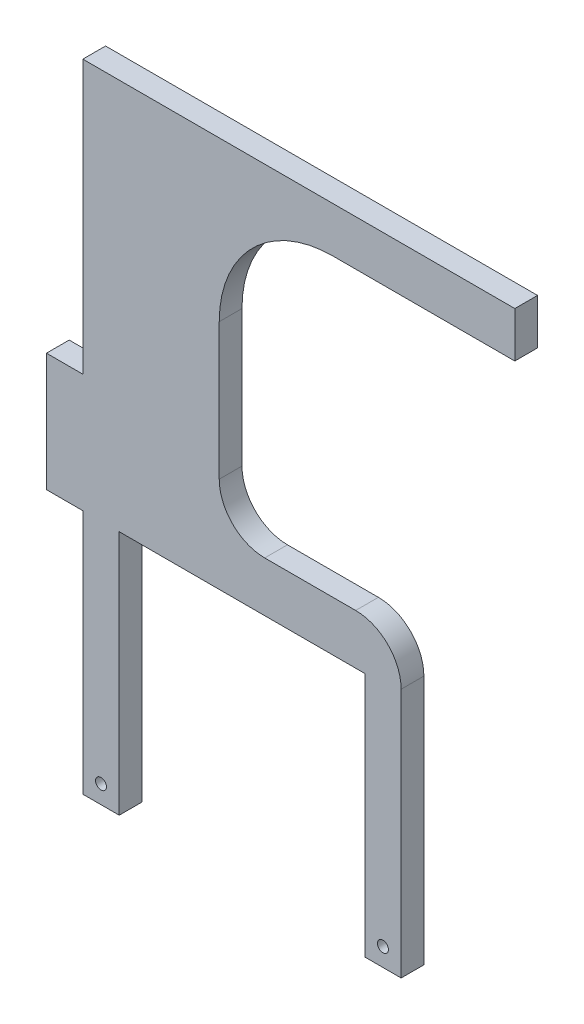
ISO-10303-21;
HEADER;
FILE_DESCRIPTION(('STEP AP214'),'2;1');
FILE_NAME('part.step','',(''),(''),'','','');
FILE_SCHEMA(('AUTOMOTIVE_DESIGN { 1 0 10303 214 1 1 1 1 }'));
ENDSEC;
DATA;
#1=APPLICATION_CONTEXT('core data for automotive mechanical design processes');
#2=APPLICATION_PROTOCOL_DEFINITION('international standard','automotive_design',2000,#1);
#3=PRODUCT_CONTEXT('',#1,'mechanical');
#4=PRODUCT('Part','Part','',(#3));
#5=PRODUCT_RELATED_PRODUCT_CATEGORY('part','',(#4));
#6=PRODUCT_DEFINITION_FORMATION('','',#4);
#7=PRODUCT_DEFINITION_CONTEXT('part definition',#1,'design');
#8=PRODUCT_DEFINITION('design','',#6,#7);
#9=PRODUCT_DEFINITION_SHAPE('','',#8);
#10=(LENGTH_UNIT() NAMED_UNIT(*) SI_UNIT(.MILLI.,.METRE.));
#11=(NAMED_UNIT(*) PLANE_ANGLE_UNIT() SI_UNIT($,.RADIAN.));
#12=(NAMED_UNIT(*) SI_UNIT($,.STERADIAN.) SOLID_ANGLE_UNIT());
#13=UNCERTAINTY_MEASURE_WITH_UNIT(LENGTH_MEASURE(1.E-05),#10,'distance_accuracy_value','');
#14=(GEOMETRIC_REPRESENTATION_CONTEXT(3) GLOBAL_UNCERTAINTY_ASSIGNED_CONTEXT((#13)) GLOBAL_UNIT_ASSIGNED_CONTEXT((#10,
#11,#12)) REPRESENTATION_CONTEXT('',''));
#15=CARTESIAN_POINT('',(0.,0.,0.));
#16=DIRECTION('',(0.,0.,1.));
#17=DIRECTION('',(1.,0.,0.));
#18=AXIS2_PLACEMENT_3D('',#15,#16,#17);
#19=CARTESIAN_POINT('',(0.,0.,5.));
#20=DIRECTION('',(0.,1.,0.));
#21=DIRECTION('',(0.,0.,1.));
#22=AXIS2_PLACEMENT_3D('',#19,#20,#21);
#23=PLANE('',#22);
#24=DIRECTION('',(1.,0.,0.));
#25=VECTOR('',#24,1.);
#26=CARTESIAN_POINT('',(0.,0.,0.));
#27=LINE('',#26,#25);
#28=CARTESIAN_POINT('',(0.,0.,0.));
#29=VERTEX_POINT('',#28);
#30=CARTESIAN_POINT('',(8.,0.,0.));
#31=VERTEX_POINT('',#30);
#32=EDGE_CURVE('E216',#29,#31,#27,.T.);
#33=ORIENTED_EDGE('',*,*,#32,.T.);
#34=DIRECTION('',(0.,0.,-1.));
#35=VECTOR('',#34,1.);
#36=CARTESIAN_POINT('',(8.,0.,5.));
#37=LINE('',#36,#35);
#38=CARTESIAN_POINT('',(8.,0.,5.));
#39=VERTEX_POINT('',#38);
#40=EDGE_CURVE('E300',#39,#31,#37,.T.);
#41=ORIENTED_EDGE('',*,*,#40,.F.);
#42=DIRECTION('',(1.,0.,0.));
#43=VECTOR('',#42,1.);
#44=CARTESIAN_POINT('',(0.,0.,5.));
#45=LINE('',#44,#43);
#46=CARTESIAN_POINT('',(0.,0.,5.));
#47=VERTEX_POINT('',#46);
#48=EDGE_CURVE('E262',#47,#39,#45,.T.);
#49=ORIENTED_EDGE('',*,*,#48,.F.);
#50=DIRECTION('',(0.,0.,-1.));
#51=VECTOR('',#50,1.);
#52=CARTESIAN_POINT('',(0.,0.,5.));
#53=LINE('',#52,#51);
#54=EDGE_CURVE('E215',#47,#29,#53,.T.);
#55=ORIENTED_EDGE('',*,*,#54,.T.);
#56=EDGE_LOOP('',(#33,#41,#49,#55));
#57=FACE_BOUND('',#56,.T.);
#58=ADVANCED_FACE('F39',(#57),#23,.F.);
#59=CARTESIAN_POINT('',(8.,0.,5.));
#60=DIRECTION('',(-1.,0.,0.));
#61=DIRECTION('',(0.,0.,1.));
#62=AXIS2_PLACEMENT_3D('',#59,#60,#61);
#63=PLANE('',#62);
#64=DIRECTION('',(0.,1.,0.));
#65=VECTOR('',#64,1.);
#66=CARTESIAN_POINT('',(8.,0.,0.));
#67=LINE('',#66,#65);
#68=CARTESIAN_POINT('',(8.,54.,0.));
#69=VERTEX_POINT('',#68);
#70=EDGE_CURVE('E220',#31,#69,#67,.T.);
#71=ORIENTED_EDGE('',*,*,#70,.T.);
#72=DIRECTION('',(0.,0.,-1.));
#73=VECTOR('',#72,1.);
#74=CARTESIAN_POINT('',(8.,54.,5.));
#75=LINE('',#74,#73);
#76=CARTESIAN_POINT('',(8.,54.,5.));
#77=VERTEX_POINT('',#76);
#78=EDGE_CURVE('E296',#77,#69,#75,.T.);
#79=ORIENTED_EDGE('',*,*,#78,.F.);
#80=DIRECTION('',(0.,1.,0.));
#81=VECTOR('',#80,1.);
#82=CARTESIAN_POINT('',(8.,0.,5.));
#83=LINE('',#82,#81);
#84=EDGE_CURVE('E371',#39,#77,#83,.T.);
#85=ORIENTED_EDGE('',*,*,#84,.F.);
#86=ORIENTED_EDGE('',*,*,#40,.T.);
#87=EDGE_LOOP('',(#71,#79,#85,#86));
#88=FACE_BOUND('',#87,.T.);
#89=ADVANCED_FACE('F409',(#88),#63,.F.);
#90=CARTESIAN_POINT('',(62.,54.,5.));
#91=DIRECTION('',(0.,1.,0.));
#92=DIRECTION('',(-1.,0.,0.));
#93=AXIS2_PLACEMENT_3D('',#90,#91,#92);
#94=PLANE('',#93);
#95=DIRECTION('',(1.,0.,0.));
#96=VECTOR('',#95,1.);
#97=CARTESIAN_POINT('',(62.,54.,0.));
#98=LINE('',#97,#96);
#99=CARTESIAN_POINT('',(62.,54.,0.));
#100=VERTEX_POINT('',#99);
#101=EDGE_CURVE('E224',#69,#100,#98,.T.);
#102=ORIENTED_EDGE('',*,*,#101,.T.);
#103=DIRECTION('',(0.,0.,-1.));
#104=VECTOR('',#103,1.);
#105=CARTESIAN_POINT('',(62.,54.,5.));
#106=LINE('',#105,#104);
#107=CARTESIAN_POINT('',(62.,54.,5.));
#108=VERTEX_POINT('',#107);
#109=EDGE_CURVE('E292',#108,#100,#106,.T.);
#110=ORIENTED_EDGE('',*,*,#109,.F.);
#111=DIRECTION('',(1.,0.,0.));
#112=VECTOR('',#111,1.);
#113=CARTESIAN_POINT('',(62.,54.,5.));
#114=LINE('',#113,#112);
#115=EDGE_CURVE('E374',#77,#108,#114,.T.);
#116=ORIENTED_EDGE('',*,*,#115,.F.);
#117=ORIENTED_EDGE('',*,*,#78,.T.);
#118=EDGE_LOOP('',(#102,#110,#116,#117));
#119=FACE_BOUND('',#118,.T.);
#120=ADVANCED_FACE('F403',(#119),#94,.F.);
#121=CARTESIAN_POINT('',(62.,0.,5.));
#122=DIRECTION('',(1.,0.,0.));
#123=DIRECTION('',(0.,0.,-1.));
#124=AXIS2_PLACEMENT_3D('',#121,#122,#123);
#125=PLANE('',#124);
#126=DIRECTION('',(0.,-1.,0.));
#127=VECTOR('',#126,1.);
#128=CARTESIAN_POINT('',(62.,0.,0.));
#129=LINE('',#128,#127);
#130=CARTESIAN_POINT('',(62.,0.,0.));
#131=VERTEX_POINT('',#130);
#132=EDGE_CURVE('E227',#100,#131,#129,.T.);
#133=ORIENTED_EDGE('',*,*,#132,.T.);
#134=DIRECTION('',(0.,0.,-1.));
#135=VECTOR('',#134,1.);
#136=CARTESIAN_POINT('',(62.,0.,5.));
#137=LINE('',#136,#135);
#138=CARTESIAN_POINT('',(62.,0.,5.));
#139=VERTEX_POINT('',#138);
#140=EDGE_CURVE('E288',#139,#131,#137,.T.);
#141=ORIENTED_EDGE('',*,*,#140,.F.);
#142=DIRECTION('',(0.,-1.,0.));
#143=VECTOR('',#142,1.);
#144=CARTESIAN_POINT('',(62.,0.,5.));
#145=LINE('',#144,#143);
#146=EDGE_CURVE('E377',#108,#139,#145,.T.);
#147=ORIENTED_EDGE('',*,*,#146,.F.);
#148=ORIENTED_EDGE('',*,*,#109,.T.);
#149=EDGE_LOOP('',(#133,#141,#147,#148));
#150=FACE_BOUND('',#149,.T.);
#151=ADVANCED_FACE('F399',(#150),#125,.F.);
#152=CARTESIAN_POINT('',(70.,0.,5.));
#153=DIRECTION('',(0.,1.,0.));
#154=DIRECTION('',(-1.,0.,0.));
#155=AXIS2_PLACEMENT_3D('',#152,#153,#154);
#156=PLANE('',#155);
#157=DIRECTION('',(1.,0.,0.));
#158=VECTOR('',#157,1.);
#159=CARTESIAN_POINT('',(70.,0.,0.));
#160=LINE('',#159,#158);
#161=CARTESIAN_POINT('',(70.,0.,0.));
#162=VERTEX_POINT('',#161);
#163=EDGE_CURVE('E230',#131,#162,#160,.T.);
#164=ORIENTED_EDGE('',*,*,#163,.T.);
#165=DIRECTION('',(0.,0.,-1.));
#166=VECTOR('',#165,1.);
#167=CARTESIAN_POINT('',(70.,0.,5.));
#168=LINE('',#167,#166);
#169=CARTESIAN_POINT('',(70.,0.,5.));
#170=VERTEX_POINT('',#169);
#171=EDGE_CURVE('E284',#170,#162,#168,.T.);
#172=ORIENTED_EDGE('',*,*,#171,.F.);
#173=DIRECTION('',(1.,0.,0.));
#174=VECTOR('',#173,1.);
#175=CARTESIAN_POINT('',(70.,0.,5.));
#176=LINE('',#175,#174);
#177=EDGE_CURVE('E380',#139,#170,#176,.T.);
#178=ORIENTED_EDGE('',*,*,#177,.F.);
#179=ORIENTED_EDGE('',*,*,#140,.T.);
#180=EDGE_LOOP('',(#164,#172,#178,#179));
#181=FACE_BOUND('',#180,.T.);
#182=ADVANCED_FACE('F395',(#181),#156,.F.);
#183=CARTESIAN_POINT('',(70.,80.,5.));
#184=DIRECTION('',(-1.,0.,0.));
#185=DIRECTION('',(0.,-1.,0.));
#186=AXIS2_PLACEMENT_3D('',#183,#184,#185);
#187=PLANE('',#186);
#188=DIRECTION('',(0.,1.,0.));
#189=VECTOR('',#188,1.);
#190=CARTESIAN_POINT('',(70.,80.,0.));
#191=LINE('',#190,#189);
#192=CARTESIAN_POINT('',(70.,55.,0.));
#193=VERTEX_POINT('',#192);
#194=EDGE_CURVE('E233',#162,#193,#191,.T.);
#195=ORIENTED_EDGE('',*,*,#194,.T.);
#196=DIRECTION('',(0.,0.,1.));
#197=VECTOR('',#196,1.);
#198=CARTESIAN_POINT('',(70.,55.,5.));
#199=LINE('',#198,#197);
#200=CARTESIAN_POINT('',(70.,55.,5.));
#201=VERTEX_POINT('',#200);
#202=EDGE_CURVE('E329',#193,#201,#199,.T.);
#203=ORIENTED_EDGE('',*,*,#202,.T.);
#204=DIRECTION('',(0.,1.,0.));
#205=VECTOR('',#204,1.);
#206=CARTESIAN_POINT('',(70.,80.,5.));
#207=LINE('',#206,#205);
#208=EDGE_CURVE('E350',#170,#201,#207,.T.);
#209=ORIENTED_EDGE('',*,*,#208,.F.);
#210=ORIENTED_EDGE('',*,*,#171,.T.);
#211=EDGE_LOOP('',(#195,#203,#209,#210));
#212=FACE_BOUND('',#211,.T.);
#213=ADVANCED_FACE('F389',(#212),#187,.F.);
#214=CARTESIAN_POINT('',(30.,130.,5.));
#215=DIRECTION('',(-1.,0.,0.));
#216=DIRECTION('',(0.,-1.,0.));
#217=AXIS2_PLACEMENT_3D('',#214,#215,#216);
#218=PLANE('',#217);
#219=DIRECTION('',(0.,1.,0.));
#220=VECTOR('',#219,1.);
#221=CARTESIAN_POINT('',(30.,130.,5.));
#222=LINE('',#221,#220);
#223=CARTESIAN_POINT('',(30.,75.,5.));
#224=VERTEX_POINT('',#223);
#225=CARTESIAN_POINT('',(30.,105.,5.));
#226=VERTEX_POINT('',#225);
#227=EDGE_CURVE('E200',#224,#226,#222,.T.);
#228=ORIENTED_EDGE('',*,*,#227,.F.);
#229=DIRECTION('',(0.,0.,1.));
#230=VECTOR('',#229,1.);
#231=CARTESIAN_POINT('',(30.,75.,0.));
#232=LINE('',#231,#230);
#233=CARTESIAN_POINT('',(30.,75.,0.));
#234=VERTEX_POINT('',#233);
#235=EDGE_CURVE('E326',#224,#234,#232,.F.);
#236=ORIENTED_EDGE('',*,*,#235,.T.);
#237=DIRECTION('',(0.,1.,0.));
#238=VECTOR('',#237,1.);
#239=CARTESIAN_POINT('',(30.,130.,0.));
#240=LINE('',#239,#238);
#241=CARTESIAN_POINT('',(30.,105.,0.));
#242=VERTEX_POINT('',#241);
#243=EDGE_CURVE('E237',#234,#242,#240,.T.);
#244=ORIENTED_EDGE('',*,*,#243,.T.);
#245=DIRECTION('',(0.,0.,-1.));
#246=VECTOR('',#245,1.);
#247=CARTESIAN_POINT('',(30.,105.,5.));
#248=LINE('',#247,#246);
#249=EDGE_CURVE('E308',#242,#226,#248,.F.);
#250=ORIENTED_EDGE('',*,*,#249,.T.);
#251=EDGE_LOOP('',(#228,#236,#244,#250));
#252=FACE_BOUND('',#251,.T.);
#253=ADVANCED_FACE('F345',(#252),#218,.F.);
#254=CARTESIAN_POINT('',(120.,130.,5.));
#255=DIRECTION('',(0.,1.,0.));
#256=DIRECTION('',(-1.,0.,0.));
#257=AXIS2_PLACEMENT_3D('',#254,#255,#256);
#258=PLANE('',#257);
#259=DIRECTION('',(1.,0.,0.));
#260=VECTOR('',#259,1.);
#261=CARTESIAN_POINT('',(120.,130.,0.));
#262=LINE('',#261,#260);
#263=CARTESIAN_POINT('',(55.,130.,0.));
#264=VERTEX_POINT('',#263);
#265=CARTESIAN_POINT('',(95.,130.,0.));
#266=VERTEX_POINT('',#265);
#267=EDGE_CURVE('E240',#264,#266,#262,.T.);
#268=ORIENTED_EDGE('',*,*,#267,.T.);
#269=DIRECTION('',(0.,0.,1.));
#270=VECTOR('',#269,1.);
#271=CARTESIAN_POINT('',(95.,130.,-26.9258240356725));
#272=LINE('',#271,#270);
#273=CARTESIAN_POINT('',(95.,130.,5.));
#274=VERTEX_POINT('',#273);
#275=EDGE_CURVE('E55',#266,#274,#272,.T.);
#276=ORIENTED_EDGE('',*,*,#275,.T.);
#277=DIRECTION('',(1.,0.,0.));
#278=VECTOR('',#277,1.);
#279=CARTESIAN_POINT('',(120.,130.,5.));
#280=LINE('',#279,#278);
#281=CARTESIAN_POINT('',(55.,130.,5.));
#282=VERTEX_POINT('',#281);
#283=EDGE_CURVE('E186',#282,#274,#280,.T.);
#284=ORIENTED_EDGE('',*,*,#283,.F.);
#285=DIRECTION('',(0.,0.,-1.));
#286=VECTOR('',#285,1.);
#287=CARTESIAN_POINT('',(55.,130.,0.));
#288=LINE('',#287,#286);
#289=EDGE_CURVE('E304',#282,#264,#288,.T.);
#290=ORIENTED_EDGE('',*,*,#289,.T.);
#291=EDGE_LOOP('',(#268,#276,#284,#290));
#292=FACE_BOUND('',#291,.T.);
#293=ADVANCED_FACE('F442',(#292),#258,.F.);
#294=CARTESIAN_POINT('',(0.,140.,5.));
#295=DIRECTION('',(0.,-1.,0.));
#296=DIRECTION('',(0.,0.,-1.));
#297=AXIS2_PLACEMENT_3D('',#294,#295,#296);
#298=PLANE('',#297);
#299=DIRECTION('',(-1.,0.,0.));
#300=VECTOR('',#299,1.);
#301=CARTESIAN_POINT('',(0.,140.,5.));
#302=LINE('',#301,#300);
#303=CARTESIAN_POINT('',(95.,140.,5.));
#304=VERTEX_POINT('',#303);
#305=CARTESIAN_POINT('',(0.,140.,5.));
#306=VERTEX_POINT('',#305);
#307=EDGE_CURVE('E183',#304,#306,#302,.T.);
#308=ORIENTED_EDGE('',*,*,#307,.F.);
#309=DIRECTION('',(0.,0.,1.));
#310=VECTOR('',#309,1.);
#311=CARTESIAN_POINT('',(95.,140.,-26.9258240356725));
#312=LINE('',#311,#310);
#313=CARTESIAN_POINT('',(95.,140.,0.));
#314=VERTEX_POINT('',#313);
#315=EDGE_CURVE('E169',#314,#304,#312,.T.);
#316=ORIENTED_EDGE('',*,*,#315,.F.);
#317=DIRECTION('',(-1.,0.,0.));
#318=VECTOR('',#317,1.);
#319=CARTESIAN_POINT('',(0.,140.,0.));
#320=LINE('',#319,#318);
#321=CARTESIAN_POINT('',(0.,140.,0.));
#322=VERTEX_POINT('',#321);
#323=EDGE_CURVE('E244',#314,#322,#320,.T.);
#324=ORIENTED_EDGE('',*,*,#323,.T.);
#325=DIRECTION('',(0.,0.,-1.));
#326=VECTOR('',#325,1.);
#327=CARTESIAN_POINT('',(0.,140.,5.));
#328=LINE('',#327,#326);
#329=EDGE_CURVE('E191',#306,#322,#328,.T.);
#330=ORIENTED_EDGE('',*,*,#329,.F.);
#331=EDGE_LOOP('',(#308,#316,#324,#330));
#332=FACE_BOUND('',#331,.T.);
#333=ADVANCED_FACE('F189',(#332),#298,.F.);
#334=CARTESIAN_POINT('',(0.,80.,5.));
#335=DIRECTION('',(1.,0.,0.));
#336=DIRECTION('',(0.,0.,-1.));
#337=AXIS2_PLACEMENT_3D('',#334,#335,#336);
#338=PLANE('',#337);
#339=DIRECTION('',(0.,-1.,0.));
#340=VECTOR('',#339,1.);
#341=CARTESIAN_POINT('',(0.,80.,0.));
#342=LINE('',#341,#340);
#343=CARTESIAN_POINT('',(0.,80.,0.));
#344=VERTEX_POINT('',#343);
#345=EDGE_CURVE('E247',#322,#344,#342,.T.);
#346=ORIENTED_EDGE('',*,*,#345,.T.);
#347=DIRECTION('',(0.,0.,-1.));
#348=VECTOR('',#347,1.);
#349=CARTESIAN_POINT('',(0.,80.,5.));
#350=LINE('',#349,#348);
#351=CARTESIAN_POINT('',(0.,80.,5.));
#352=VERTEX_POINT('',#351);
#353=EDGE_CURVE('E278',#352,#344,#350,.T.);
#354=ORIENTED_EDGE('',*,*,#353,.F.);
#355=DIRECTION('',(0.,-1.,0.));
#356=VECTOR('',#355,1.);
#357=CARTESIAN_POINT('',(0.,80.,5.));
#358=LINE('',#357,#356);
#359=EDGE_CURVE('E194',#306,#352,#358,.T.);
#360=ORIENTED_EDGE('',*,*,#359,.F.);
#361=ORIENTED_EDGE('',*,*,#329,.T.);
#362=EDGE_LOOP('',(#346,#354,#360,#361));
#363=FACE_BOUND('',#362,.T.);
#364=ADVANCED_FACE('F434',(#363),#338,.F.);
#365=CARTESIAN_POINT('',(0.,80.,5.));
#366=DIRECTION('',(0.,-1.,0.));
#367=DIRECTION('',(0.,0.,-1.));
#368=AXIS2_PLACEMENT_3D('',#365,#366,#367);
#369=PLANE('',#368);
#370=DIRECTION('',(-1.,0.,0.));
#371=VECTOR('',#370,1.);
#372=CARTESIAN_POINT('',(0.,80.,0.));
#373=LINE('',#372,#371);
#374=CARTESIAN_POINT('',(-8.,80.,0.));
#375=VERTEX_POINT('',#374);
#376=EDGE_CURVE('E250',#344,#375,#373,.T.);
#377=ORIENTED_EDGE('',*,*,#376,.T.);
#378=DIRECTION('',(0.,0.,-1.));
#379=VECTOR('',#378,1.);
#380=CARTESIAN_POINT('',(-8.,80.,5.));
#381=LINE('',#380,#379);
#382=CARTESIAN_POINT('',(-8.,80.,5.));
#383=VERTEX_POINT('',#382);
#384=EDGE_CURVE('E274',#383,#375,#381,.T.);
#385=ORIENTED_EDGE('',*,*,#384,.F.);
#386=DIRECTION('',(-1.,0.,0.));
#387=VECTOR('',#386,1.);
#388=CARTESIAN_POINT('',(0.,80.,5.));
#389=LINE('',#388,#387);
#390=EDGE_CURVE('E198',#352,#383,#389,.T.);
#391=ORIENTED_EDGE('',*,*,#390,.F.);
#392=ORIENTED_EDGE('',*,*,#353,.T.);
#393=EDGE_LOOP('',(#377,#385,#391,#392));
#394=FACE_BOUND('',#393,.T.);
#395=ADVANCED_FACE('F430',(#394),#369,.F.);
#396=CARTESIAN_POINT('',(-8.,80.,5.));
#397=DIRECTION('',(1.,0.,0.));
#398=DIRECTION('',(0.,1.,0.));
#399=AXIS2_PLACEMENT_3D('',#396,#397,#398);
#400=PLANE('',#399);
#401=DIRECTION('',(0.,-1.,0.));
#402=VECTOR('',#401,1.);
#403=CARTESIAN_POINT('',(-8.,80.,0.));
#404=LINE('',#403,#402);
#405=CARTESIAN_POINT('',(-8.,54.,0.));
#406=VERTEX_POINT('',#405);
#407=EDGE_CURVE('E253',#375,#406,#404,.T.);
#408=ORIENTED_EDGE('',*,*,#407,.T.);
#409=DIRECTION('',(0.,0.,-1.));
#410=VECTOR('',#409,1.);
#411=CARTESIAN_POINT('',(-8.,54.,5.));
#412=LINE('',#411,#410);
#413=CARTESIAN_POINT('',(-8.,54.,5.));
#414=VERTEX_POINT('',#413);
#415=EDGE_CURVE('E270',#414,#406,#412,.T.);
#416=ORIENTED_EDGE('',*,*,#415,.F.);
#417=DIRECTION('',(0.,-1.,0.));
#418=VECTOR('',#417,1.);
#419=CARTESIAN_POINT('',(-8.,80.,5.));
#420=LINE('',#419,#418);
#421=EDGE_CURVE('E206',#383,#414,#420,.T.);
#422=ORIENTED_EDGE('',*,*,#421,.F.);
#423=ORIENTED_EDGE('',*,*,#384,.T.);
#424=EDGE_LOOP('',(#408,#416,#422,#423));
#425=FACE_BOUND('',#424,.T.);
#426=ADVANCED_FACE('F426',(#425),#400,.F.);
#427=CARTESIAN_POINT('',(-8.,54.,5.));
#428=DIRECTION('',(0.,1.,0.));
#429=DIRECTION('',(0.,0.,1.));
#430=AXIS2_PLACEMENT_3D('',#427,#428,#429);
#431=PLANE('',#430);
#432=DIRECTION('',(1.,0.,0.));
#433=VECTOR('',#432,1.);
#434=CARTESIAN_POINT('',(-8.,54.,0.));
#435=LINE('',#434,#433);
#436=CARTESIAN_POINT('',(0.,54.,0.));
#437=VERTEX_POINT('',#436);
#438=EDGE_CURVE('E256',#406,#437,#435,.T.);
#439=ORIENTED_EDGE('',*,*,#438,.T.);
#440=DIRECTION('',(0.,0.,-1.));
#441=VECTOR('',#440,1.);
#442=CARTESIAN_POINT('',(0.,54.,5.));
#443=LINE('',#442,#441);
#444=CARTESIAN_POINT('',(0.,54.,5.));
#445=VERTEX_POINT('',#444);
#446=EDGE_CURVE('E266',#445,#437,#443,.T.);
#447=ORIENTED_EDGE('',*,*,#446,.F.);
#448=DIRECTION('',(1.,0.,0.));
#449=VECTOR('',#448,1.);
#450=CARTESIAN_POINT('',(-8.,54.,5.));
#451=LINE('',#450,#449);
#452=EDGE_CURVE('E209',#414,#445,#451,.T.);
#453=ORIENTED_EDGE('',*,*,#452,.F.);
#454=ORIENTED_EDGE('',*,*,#415,.T.);
#455=EDGE_LOOP('',(#439,#447,#453,#454));
#456=FACE_BOUND('',#455,.T.);
#457=ADVANCED_FACE('F421',(#456),#431,.F.);
#458=CARTESIAN_POINT('',(0.,0.,5.));
#459=DIRECTION('',(1.,0.,0.));
#460=DIRECTION('',(0.,0.,-1.));
#461=AXIS2_PLACEMENT_3D('',#458,#459,#460);
#462=PLANE('',#461);
#463=DIRECTION('',(0.,-1.,0.));
#464=VECTOR('',#463,1.);
#465=CARTESIAN_POINT('',(0.,0.,0.));
#466=LINE('',#465,#464);
#467=EDGE_CURVE('E259',#437,#29,#466,.T.);
#468=ORIENTED_EDGE('',*,*,#467,.T.);
#469=ORIENTED_EDGE('',*,*,#54,.F.);
#470=DIRECTION('',(0.,-1.,0.));
#471=VECTOR('',#470,1.);
#472=CARTESIAN_POINT('',(0.,0.,5.));
#473=LINE('',#472,#471);
#474=EDGE_CURVE('E212',#445,#47,#473,.T.);
#475=ORIENTED_EDGE('',*,*,#474,.F.);
#476=ORIENTED_EDGE('',*,*,#446,.T.);
#477=EDGE_LOOP('',(#468,#469,#475,#476));
#478=FACE_BOUND('',#477,.T.);
#479=ADVANCED_FACE('F415',(#478),#462,.F.);
#480=CARTESIAN_POINT('',(0.,0.,5.));
#481=DIRECTION('',(0.,0.,1.));
#482=DIRECTION('',(1.,0.,0.));
#483=AXIS2_PLACEMENT_3D('',#480,#481,#482);
#484=PLANE('',#483);
#485=DIRECTION('',(0.,-1.,0.));
#486=VECTOR('',#485,1.);
#487=CARTESIAN_POINT('',(95.,130.,5.));
#488=LINE('',#487,#486);
#489=EDGE_CURVE('E172',#304,#274,#488,.T.);
#490=ORIENTED_EDGE('',*,*,#489,.F.);
#491=ORIENTED_EDGE('',*,*,#307,.T.);
#492=ORIENTED_EDGE('',*,*,#359,.T.);
#493=ORIENTED_EDGE('',*,*,#390,.T.);
#494=ORIENTED_EDGE('',*,*,#421,.T.);
#495=ORIENTED_EDGE('',*,*,#452,.T.);
#496=ORIENTED_EDGE('',*,*,#474,.T.);
#497=ORIENTED_EDGE('',*,*,#48,.T.);
#498=ORIENTED_EDGE('',*,*,#84,.T.);
#499=ORIENTED_EDGE('',*,*,#115,.T.);
#500=ORIENTED_EDGE('',*,*,#146,.T.);
#501=ORIENTED_EDGE('',*,*,#177,.T.);
#502=ORIENTED_EDGE('',*,*,#208,.T.);
#503=CARTESIAN_POINT('',(60.,55.,5.));
#504=DIRECTION('',(0.,0.,1.));
#505=DIRECTION('',(1.,0.,0.));
#506=AXIS2_PLACEMENT_3D('',#503,#504,#505);
#507=CIRCLE('',#506,10.);
#508=CARTESIAN_POINT('',(60.,65.,5.));
#509=VERTEX_POINT('',#508);
#510=EDGE_CURVE('E63',#201,#509,#507,.T.);
#511=ORIENTED_EDGE('',*,*,#510,.T.);
#512=DIRECTION('',(1.,0.,0.));
#513=VECTOR('',#512,1.);
#514=CARTESIAN_POINT('',(70.,65.,5.));
#515=LINE('',#514,#513);
#516=CARTESIAN_POINT('',(40.,65.,5.));
#517=VERTEX_POINT('',#516);
#518=EDGE_CURVE('E340',#517,#509,#515,.T.);
#519=ORIENTED_EDGE('',*,*,#518,.F.);
#520=CARTESIAN_POINT('',(40.,75.,5.));
#521=DIRECTION('',(0.,0.,1.));
#522=DIRECTION('',(1.,0.,0.));
#523=AXIS2_PLACEMENT_3D('',#520,#521,#522);
#524=CIRCLE('',#523,10.);
#525=EDGE_CURVE('E48',#517,#224,#524,.F.);
#526=ORIENTED_EDGE('',*,*,#525,.T.);
#527=ORIENTED_EDGE('',*,*,#227,.T.);
#528=CARTESIAN_POINT('',(55.,105.,5.));
#529=DIRECTION('',(0.,0.,1.));
#530=DIRECTION('',(1.,0.,0.));
#531=AXIS2_PLACEMENT_3D('',#528,#529,#530);
#532=CIRCLE('',#531,25.);
#533=EDGE_CURVE('E316',#226,#282,#532,.F.);
#534=ORIENTED_EDGE('',*,*,#533,.T.);
#535=ORIENTED_EDGE('',*,*,#283,.T.);
#536=EDGE_LOOP('',(#490,#491,#492,#493,#494,#495,#496,#497,#498,#499,#500,#501,#502,#511,#519,
#526,#527,#534,#535));
#537=FACE_BOUND('',#536,.T.);
#538=CARTESIAN_POINT('',(4.,4.,5.));
#539=DIRECTION('',(0.,0.,1.));
#540=DIRECTION('',(1.,0.,0.));
#541=AXIS2_PLACEMENT_3D('',#538,#539,#540);
#542=CIRCLE('',#541,1.19999999999999);
#543=CARTESIAN_POINT('',(5.19999999999999,4.,5.));
#544=VERTEX_POINT('',#543);
#545=EDGE_CURVE('E627',#544,#544,#542,.T.);
#546=ORIENTED_EDGE('',*,*,#545,.F.);
#547=EDGE_LOOP('',(#546));
#548=FACE_BOUND('',#547,.T.);
#549=CARTESIAN_POINT('',(66.,4.,5.));
#550=DIRECTION('',(0.,0.,1.));
#551=DIRECTION('',(1.,0.,0.));
#552=AXIS2_PLACEMENT_3D('',#549,#550,#551);
#553=CIRCLE('',#552,1.19999999999999);
#554=CARTESIAN_POINT('',(67.2,4.,5.));
#555=VERTEX_POINT('',#554);
#556=EDGE_CURVE('E638',#555,#555,#553,.T.);
#557=ORIENTED_EDGE('',*,*,#556,.F.);
#558=EDGE_LOOP('',(#557));
#559=FACE_BOUND('',#558,.T.);
#560=ADVANCED_FACE('F181',(#537,#548,#559),#484,.T.);
#561=CARTESIAN_POINT('',(0.,0.,0.));
#562=DIRECTION('',(0.,0.,1.));
#563=DIRECTION('',(1.,0.,0.));
#564=AXIS2_PLACEMENT_3D('',#561,#562,#563);
#565=PLANE('',#564);
#566=CARTESIAN_POINT('',(4.,4.,0.));
#567=DIRECTION('',(0.,0.,1.));
#568=DIRECTION('',(1.,0.,0.));
#569=AXIS2_PLACEMENT_3D('',#566,#567,#568);
#570=CIRCLE('',#569,1.19999999999999);
#571=CARTESIAN_POINT('',(5.19999999999999,4.,0.));
#572=VERTEX_POINT('',#571);
#573=EDGE_CURVE('E632',#572,#572,#570,.T.);
#574=ORIENTED_EDGE('',*,*,#573,.T.);
#575=EDGE_LOOP('',(#574));
#576=FACE_BOUND('',#575,.T.);
#577=CARTESIAN_POINT('',(66.,4.,0.));
#578=DIRECTION('',(0.,0.,1.));
#579=DIRECTION('',(1.,0.,0.));
#580=AXIS2_PLACEMENT_3D('',#577,#578,#579);
#581=CIRCLE('',#580,1.19999999999999);
#582=CARTESIAN_POINT('',(67.2,4.,0.));
#583=VERTEX_POINT('',#582);
#584=EDGE_CURVE('E363',#583,#583,#581,.T.);
#585=ORIENTED_EDGE('',*,*,#584,.T.);
#586=EDGE_LOOP('',(#585));
#587=FACE_BOUND('',#586,.T.);
#588=ORIENTED_EDGE('',*,*,#323,.F.);
#589=DIRECTION('',(0.,1.,0.));
#590=VECTOR('',#589,1.);
#591=CARTESIAN_POINT('',(95.,130.,0.));
#592=LINE('',#591,#590);
#593=EDGE_CURVE('E173',#266,#314,#592,.T.);
#594=ORIENTED_EDGE('',*,*,#593,.F.);
#595=ORIENTED_EDGE('',*,*,#267,.F.);
#596=CARTESIAN_POINT('',(55.,105.,0.));
#597=DIRECTION('',(0.,0.,1.));
#598=DIRECTION('',(1.,0.,0.));
#599=AXIS2_PLACEMENT_3D('',#596,#597,#598);
#600=CIRCLE('',#599,25.);
#601=EDGE_CURVE('E312',#264,#242,#600,.T.);
#602=ORIENTED_EDGE('',*,*,#601,.T.);
#603=ORIENTED_EDGE('',*,*,#243,.F.);
#604=CARTESIAN_POINT('',(40.,75.,0.));
#605=DIRECTION('',(0.,0.,1.));
#606=DIRECTION('',(1.,0.,0.));
#607=AXIS2_PLACEMENT_3D('',#604,#605,#606);
#608=CIRCLE('',#607,10.);
#609=CARTESIAN_POINT('',(40.,65.,0.));
#610=VERTEX_POINT('',#609);
#611=EDGE_CURVE('E11',#234,#610,#608,.T.);
#612=ORIENTED_EDGE('',*,*,#611,.T.);
#613=DIRECTION('',(-1.,0.,0.));
#614=VECTOR('',#613,1.);
#615=CARTESIAN_POINT('',(70.,65.,0.));
#616=LINE('',#615,#614);
#617=CARTESIAN_POINT('',(60.,65.,0.));
#618=VERTEX_POINT('',#617);
#619=EDGE_CURVE('E221',#618,#610,#616,.T.);
#620=ORIENTED_EDGE('',*,*,#619,.F.);
#621=CARTESIAN_POINT('',(60.,55.,0.));
#622=DIRECTION('',(0.,0.,1.));
#623=DIRECTION('',(1.,0.,0.));
#624=AXIS2_PLACEMENT_3D('',#621,#622,#623);
#625=CIRCLE('',#624,10.);
#626=EDGE_CURVE('E334',#618,#193,#625,.F.);
#627=ORIENTED_EDGE('',*,*,#626,.T.);
#628=ORIENTED_EDGE('',*,*,#194,.F.);
#629=ORIENTED_EDGE('',*,*,#163,.F.);
#630=ORIENTED_EDGE('',*,*,#132,.F.);
#631=ORIENTED_EDGE('',*,*,#101,.F.);
#632=ORIENTED_EDGE('',*,*,#70,.F.);
#633=ORIENTED_EDGE('',*,*,#32,.F.);
#634=ORIENTED_EDGE('',*,*,#467,.F.);
#635=ORIENTED_EDGE('',*,*,#438,.F.);
#636=ORIENTED_EDGE('',*,*,#407,.F.);
#637=ORIENTED_EDGE('',*,*,#376,.F.);
#638=ORIENTED_EDGE('',*,*,#345,.F.);
#639=EDGE_LOOP('',(#588,#594,#595,#602,#603,#612,#620,#627,#628,#629,#630,#631,#632,#633,#634,
#635,#636,#637,#638));
#640=FACE_BOUND('',#639,.T.);
#641=ADVANCED_FACE('F356',(#576,#587,#640),#565,.F.);
#642=CARTESIAN_POINT('',(55.,105.,5.));
#643=DIRECTION('',(0.,0.,1.));
#644=DIRECTION('',(1.,0.,0.));
#645=AXIS2_PLACEMENT_3D('',#642,#643,#644);
#646=CYLINDRICAL_SURFACE('',#645,25.);
#647=ORIENTED_EDGE('',*,*,#533,.F.);
#648=ORIENTED_EDGE('',*,*,#249,.F.);
#649=ORIENTED_EDGE('',*,*,#601,.F.);
#650=ORIENTED_EDGE('',*,*,#289,.F.);
#651=EDGE_LOOP('',(#647,#648,#649,#650));
#652=FACE_BOUND('',#651,.T.);
#653=ADVANCED_FACE('F452',(#652),#646,.F.);
#654=CARTESIAN_POINT('',(70.,65.,-42.7200187265877));
#655=DIRECTION('',(0.,-1.,0.));
#656=DIRECTION('',(0.,0.,-1.));
#657=AXIS2_PLACEMENT_3D('',#654,#655,#656);
#658=PLANE('',#657);
#659=ORIENTED_EDGE('',*,*,#619,.T.);
#660=DIRECTION('',(0.,0.,1.));
#661=VECTOR('',#660,1.);
#662=CARTESIAN_POINT('',(40.,65.,5.));
#663=LINE('',#662,#661);
#664=EDGE_CURVE('E322',#610,#517,#663,.T.);
#665=ORIENTED_EDGE('',*,*,#664,.T.);
#666=ORIENTED_EDGE('',*,*,#518,.T.);
#667=DIRECTION('',(0.,0.,1.));
#668=VECTOR('',#667,1.);
#669=CARTESIAN_POINT('',(60.,65.,-42.7200187265877));
#670=LINE('',#669,#668);
#671=EDGE_CURVE('E319',#509,#618,#670,.F.);
#672=ORIENTED_EDGE('',*,*,#671,.T.);
#673=EDGE_LOOP('',(#659,#665,#666,#672));
#674=FACE_BOUND('',#673,.T.);
#675=ADVANCED_FACE('F359',(#674),#658,.F.);
#676=CARTESIAN_POINT('',(40.,75.,-42.7200187265877));
#677=DIRECTION('',(0.,0.,-1.));
#678=DIRECTION('',(-1.,0.,0.));
#679=AXIS2_PLACEMENT_3D('',#676,#677,#678);
#680=CYLINDRICAL_SURFACE('',#679,10.);
#681=ORIENTED_EDGE('',*,*,#611,.F.);
#682=ORIENTED_EDGE('',*,*,#235,.F.);
#683=ORIENTED_EDGE('',*,*,#525,.F.);
#684=ORIENTED_EDGE('',*,*,#664,.F.);
#685=EDGE_LOOP('',(#681,#682,#683,#684));
#686=FACE_BOUND('',#685,.T.);
#687=ADVANCED_FACE('F352',(#686),#680,.F.);
#688=CARTESIAN_POINT('',(60.,55.,5.));
#689=DIRECTION('',(0.,0.,1.));
#690=DIRECTION('',(1.,0.,0.));
#691=AXIS2_PLACEMENT_3D('',#688,#689,#690);
#692=CYLINDRICAL_SURFACE('',#691,10.);
#693=ORIENTED_EDGE('',*,*,#626,.F.);
#694=ORIENTED_EDGE('',*,*,#671,.F.);
#695=ORIENTED_EDGE('',*,*,#510,.F.);
#696=ORIENTED_EDGE('',*,*,#202,.F.);
#697=EDGE_LOOP('',(#693,#694,#695,#696));
#698=FACE_BOUND('',#697,.T.);
#699=ADVANCED_FACE('F41',(#698),#692,.T.);
#700=CARTESIAN_POINT('',(66.,4.,5.));
#701=DIRECTION('',(0.,0.,1.));
#702=DIRECTION('',(1.,0.,0.));
#703=AXIS2_PLACEMENT_3D('',#700,#701,#702);
#704=CYLINDRICAL_SURFACE('',#703,1.19999999999999);
#705=ORIENTED_EDGE('',*,*,#584,.F.);
#706=EDGE_LOOP('',(#705));
#707=FACE_BOUND('',#706,.T.);
#708=ORIENTED_EDGE('',*,*,#556,.T.);
#709=EDGE_LOOP('',(#708));
#710=FACE_BOUND('',#709,.T.);
#711=ADVANCED_FACE('F460',(#707,#710),#704,.F.);
#712=CARTESIAN_POINT('',(4.,4.,5.));
#713=DIRECTION('',(0.,0.,1.));
#714=DIRECTION('',(1.,0.,0.));
#715=AXIS2_PLACEMENT_3D('',#712,#713,#714);
#716=CYLINDRICAL_SURFACE('',#715,1.19999999999999);
#717=ORIENTED_EDGE('',*,*,#573,.F.);
#718=EDGE_LOOP('',(#717));
#719=FACE_BOUND('',#718,.T.);
#720=ORIENTED_EDGE('',*,*,#545,.T.);
#721=EDGE_LOOP('',(#720));
#722=FACE_BOUND('',#721,.T.);
#723=ADVANCED_FACE('F546',(#719,#722),#716,.F.);
#724=CARTESIAN_POINT('',(95.,130.,-26.9258240356725));
#725=DIRECTION('',(-1.,0.,0.));
#726=DIRECTION('',(0.,0.,1.));
#727=AXIS2_PLACEMENT_3D('',#724,#725,#726);
#728=PLANE('',#727);
#729=ORIENTED_EDGE('',*,*,#593,.T.);
#730=ORIENTED_EDGE('',*,*,#315,.T.);
#731=ORIENTED_EDGE('',*,*,#489,.T.);
#732=ORIENTED_EDGE('',*,*,#275,.F.);
#733=EDGE_LOOP('',(#729,#730,#731,#732));
#734=FACE_BOUND('',#733,.T.);
#735=ADVANCED_FACE('F171',(#734),#728,.F.);
#736=CLOSED_SHELL('',(#58,#89,#120,#151,#182,#213,#253,#293,#333,#364,#395,#426,#457,#479,#560,
#641,#653,#675,#687,#699,#711,#723,#735));
#737=MANIFOLD_SOLID_BREP('B2',#736);
#738=ADVANCED_BREP_SHAPE_REPRESENTATION('',(#18,#737),#14);
#739=SHAPE_DEFINITION_REPRESENTATION(#9,#738);
ENDSEC;
END-ISO-10303-21;
